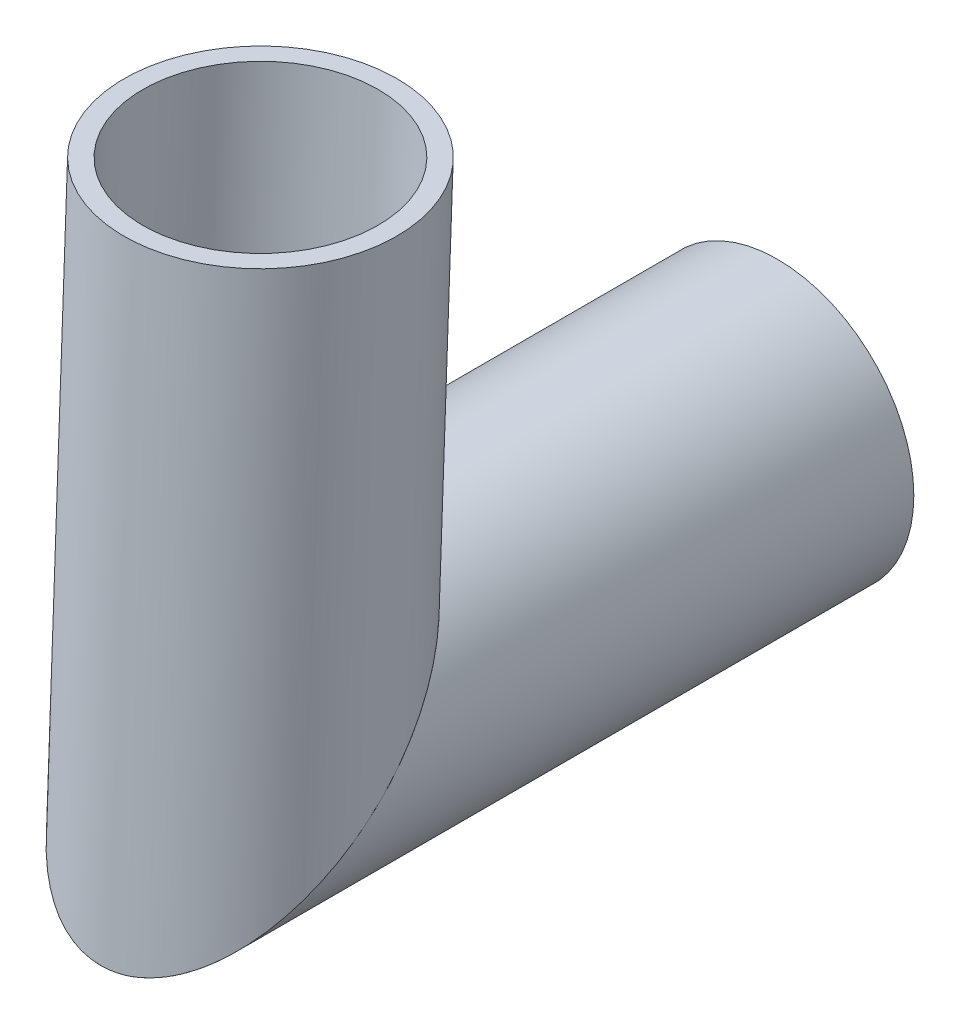
ISO-10303-21;
HEADER;
FILE_DESCRIPTION(('STEP AP214'),'2;1');
FILE_NAME('part.step','',(''),(''),'','','');
FILE_SCHEMA(('AUTOMOTIVE_DESIGN { 1 0 10303 214 1 1 1 1 }'));
ENDSEC;
DATA;
#1=APPLICATION_CONTEXT('core data for automotive mechanical design processes');
#2=APPLICATION_PROTOCOL_DEFINITION('international standard','automotive_design',2000,#1);
#3=PRODUCT_CONTEXT('',#1,'mechanical');
#4=PRODUCT('Part','Part','',(#3));
#5=PRODUCT_RELATED_PRODUCT_CATEGORY('part','',(#4));
#6=PRODUCT_DEFINITION_FORMATION('','',#4);
#7=PRODUCT_DEFINITION_CONTEXT('part definition',#1,'design');
#8=PRODUCT_DEFINITION('design','',#6,#7);
#9=PRODUCT_DEFINITION_SHAPE('','',#8);
#10=(LENGTH_UNIT() NAMED_UNIT(*) SI_UNIT(.MILLI.,.METRE.));
#11=(NAMED_UNIT(*) PLANE_ANGLE_UNIT() SI_UNIT($,.RADIAN.));
#12=(NAMED_UNIT(*) SI_UNIT($,.STERADIAN.) SOLID_ANGLE_UNIT());
#13=UNCERTAINTY_MEASURE_WITH_UNIT(LENGTH_MEASURE(1.E-05),#10,'distance_accuracy_value','');
#14=(GEOMETRIC_REPRESENTATION_CONTEXT(3) GLOBAL_UNCERTAINTY_ASSIGNED_CONTEXT((#13)) GLOBAL_UNIT_ASSIGNED_CONTEXT((#10,
#11,#12)) REPRESENTATION_CONTEXT('',''));
#15=CARTESIAN_POINT('',(0.,0.,0.));
#16=DIRECTION('',(0.,0.,1.));
#17=DIRECTION('',(1.,0.,0.));
#18=AXIS2_PLACEMENT_3D('',#15,#16,#17);
#19=CARTESIAN_POINT('',(25.4037084153649,1393.5417766657,2990.));
#20=DIRECTION('',(0.,0.,-1.));
#21=DIRECTION('',(-1.,0.,0.));
#22=AXIS2_PLACEMENT_3D('',#19,#20,#21);
#23=CYLINDRICAL_SURFACE('',#22,22.);
#24=CARTESIAN_POINT('',(25.4037084153649,1393.5417766657,2890.));
#25=DIRECTION('',(0.,0.,1.));
#26=DIRECTION('',(1.,0.,0.));
#27=AXIS2_PLACEMENT_3D('',#24,#25,#26);
#28=CIRCLE('',#27,22.);
#29=CARTESIAN_POINT('',(47.4037084153649,1393.5417766657,2890.));
#30=VERTEX_POINT('',#29);
#31=EDGE_CURVE('E62',#30,#30,#28,.T.);
#32=ORIENTED_EDGE('',*,*,#31,.F.);
#33=EDGE_LOOP('',(#32));
#34=FACE_BOUND('',#33,.T.);
#35=CARTESIAN_POINT('',(25.4037084153649,1393.5417766657,2990.));
#36=DIRECTION('',(-0.0052075345297579,0.722570262479926,0.691277872757267));
#37=DIRECTION('',(-0.00498188216971623,0.691259920879157,-0.722589027481174));
#38=AXIS2_PLACEMENT_3D('',#35,#36,#37);
#39=ELLIPSE('',#38,31.8251181861929,22.);
#40=CARTESIAN_POINT('',(25.245159426524,1415.54120534506,2967.00351880037));
#41=VERTEX_POINT('',#40);
#42=EDGE_CURVE('E58',#41,#41,#39,.T.);
#43=ORIENTED_EDGE('',*,*,#42,.T.);
#44=EDGE_LOOP('',(#43));
#45=FACE_BOUND('',#44,.T.);
#46=ADVANCED_FACE('F54',(#34,#45),#23,.F.);
#47=CARTESIAN_POINT('',(25.4037084153649,1393.5417766657,2990.));
#48=DIRECTION('',(0.,0.,-1.));
#49=DIRECTION('',(-1.,0.,0.));
#50=AXIS2_PLACEMENT_3D('',#47,#48,#49);
#51=CYLINDRICAL_SURFACE('',#50,25.5);
#52=CARTESIAN_POINT('',(25.4037084153649,1393.5417766657,2890.));
#53=DIRECTION('',(0.,0.,1.));
#54=DIRECTION('',(1.,0.,0.));
#55=AXIS2_PLACEMENT_3D('',#52,#53,#54);
#56=CIRCLE('',#55,25.5);
#57=CARTESIAN_POINT('',(50.9037084153649,1393.5417766657,2890.));
#58=VERTEX_POINT('',#57);
#59=EDGE_CURVE('E66',#58,#58,#56,.T.);
#60=ORIENTED_EDGE('',*,*,#59,.T.);
#61=EDGE_LOOP('',(#60));
#62=FACE_BOUND('',#61,.T.);
#63=CARTESIAN_POINT('',(25.4037084153649,1393.5417766657,2990.));
#64=DIRECTION('',(-0.0052075345297579,0.722570262479926,0.691277872757267));
#65=DIRECTION('',(-0.00498188216971623,0.691259920879157,-0.722589027481174));
#66=AXIS2_PLACEMENT_3D('',#63,#64,#65);
#67=ELLIPSE('',#66,36.8882051703599,25.5);
#68=CARTESIAN_POINT('',(25.2199357237539,1419.04111445314,2963.34498770042));
#69=VERTEX_POINT('',#68);
#70=EDGE_CURVE('E12',#69,#69,#67,.T.);
#71=ORIENTED_EDGE('',*,*,#70,.F.);
#72=EDGE_LOOP('',(#71));
#73=FACE_BOUND('',#72,.T.);
#74=ADVANCED_FACE('F81',(#62,#73),#51,.T.);
#75=CARTESIAN_POINT('',(25.4037084153649,1393.5417766657,2890.));
#76=DIRECTION('',(0.,0.,1.));
#77=DIRECTION('',(1.,0.,0.));
#78=AXIS2_PLACEMENT_3D('',#75,#76,#77);
#79=PLANE('',#78);
#80=ORIENTED_EDGE('',*,*,#31,.T.);
#81=EDGE_LOOP('',(#80));
#82=FACE_BOUND('',#81,.T.);
#83=ORIENTED_EDGE('',*,*,#59,.F.);
#84=EDGE_LOOP('',(#83));
#85=FACE_BOUND('',#84,.T.);
#86=ADVANCED_FACE('F77',(#82,#85),#79,.F.);
#87=CARTESIAN_POINT('',(25.4037084153649,1393.5417766657,2990.));
#88=DIRECTION('',(-0.0052075345297579,0.722570262479926,0.691277872757267));
#89=DIRECTION('',(0.,-0.691287246128331,0.72258006015964));
#90=AXIS2_PLACEMENT_3D('',#87,#88,#89);
#91=PLANE('',#90);
#92=ORIENTED_EDGE('',*,*,#42,.F.);
#93=EDGE_LOOP('',(#92));
#94=FACE_BOUND('',#93,.T.);
#95=ORIENTED_EDGE('',*,*,#70,.T.);
#96=EDGE_LOOP('',(#95));
#97=FACE_BOUND('',#96,.T.);
#98=ADVANCED_FACE('F56',(#94,#97),#91,.T.);
#99=CLOSED_SHELL('',(#46,#74,#86,#98));
#100=MANIFOLD_SOLID_BREP('B2',#99);
#101=CARTESIAN_POINT('',(23.6366012416464,1638.73632833836,2979.13435049204));
#102=DIRECTION('',(0.00719970678408211,-0.998993667929567,0.0442698052723766));
#103=DIRECTION('',(0.,-0.0442709526968791,-0.999019560743087));
#104=AXIS2_PLACEMENT_3D('',#101,#102,#103);
#105=CYLINDRICAL_SURFACE('',#104,22.);
#106=CARTESIAN_POINT('',(25.4037084153649,1393.5417766657,2990.));
#107=DIRECTION('',(0.0052075345297579,-0.722570262479926,-0.691277872757267));
#108=DIRECTION('',(0.00498188216971623,-0.691259920879157,0.722589027481174));
#109=AXIS2_PLACEMENT_3D('',#106,#107,#108);
#110=ELLIPSE('',#109,31.8251181861929,22.);
#111=CARTESIAN_POINT('',(25.5622574042058,1371.54234798634,3012.99648119964));
#112=VERTEX_POINT('',#111);
#113=EDGE_CURVE('E147',#112,#112,#110,.T.);
#114=ORIENTED_EDGE('',*,*,#113,.T.);
#115=EDGE_LOOP('',(#114));
#116=FACE_BOUND('',#115,.T.);
#117=CARTESIAN_POINT('',(24.7574093581775,1483.21885450817,2986.02601407704));
#118=DIRECTION('',(0.,1.,0.));
#119=DIRECTION('',(0.160523434739847,0.,0.987032029317855));
#120=AXIS2_PLACEMENT_3D('',#117,#118,#119);
#121=ELLIPSE('',#120,22.0221616074859,22.);
#122=CARTESIAN_POINT('',(28.2924823798071,1483.21885450817,3007.76259293844));
#123=VERTEX_POINT('',#122);
#124=EDGE_CURVE('E152',#123,#123,#121,.T.);
#125=ORIENTED_EDGE('',*,*,#124,.T.);
#126=EDGE_LOOP('',(#125));
#127=FACE_BOUND('',#126,.T.);
#128=ADVANCED_FACE('F139',(#116,#127),#105,.F.);
#129=CARTESIAN_POINT('',(23.6366012416464,1638.73632833836,2979.13435049204));
#130=DIRECTION('',(0.00719970678408211,-0.998993667929567,0.0442698052723766));
#131=DIRECTION('',(0.,-0.0442709526968791,-0.999019560743087));
#132=AXIS2_PLACEMENT_3D('',#129,#130,#131);
#133=CYLINDRICAL_SURFACE('',#132,25.5);
#134=CARTESIAN_POINT('',(25.4037084153649,1393.5417766657,2990.));
#135=DIRECTION('',(0.0052075345297579,-0.722570262479926,-0.691277872757267));
#136=DIRECTION('',(0.00498188216971623,-0.691259920879157,0.722589027481174));
#137=AXIS2_PLACEMENT_3D('',#134,#135,#136);
#138=ELLIPSE('',#137,36.8882051703599,25.5);
#139=CARTESIAN_POINT('',(25.5874811069759,1368.04243887826,3016.65501229958));
#140=VERTEX_POINT('',#139);
#141=EDGE_CURVE('E53',#140,#140,#138,.T.);
#142=ORIENTED_EDGE('',*,*,#141,.F.);
#143=EDGE_LOOP('',(#142));
#144=FACE_BOUND('',#143,.T.);
#145=CARTESIAN_POINT('',(24.7574093581775,1483.21885450817,2986.02601407704));
#146=DIRECTION('',(0.,1.,0.));
#147=DIRECTION('',(0.160523434739847,0.,0.987032029317855));
#148=AXIS2_PLACEMENT_3D('',#145,#146,#147);
#149=ELLIPSE('',#148,25.5256873177677,25.5);
#150=CARTESIAN_POINT('',(28.8548803605209,1483.21885450817,3011.22068503003));
#151=VERTEX_POINT('',#150);
#152=EDGE_CURVE('E143',#151,#151,#149,.T.);
#153=ORIENTED_EDGE('',*,*,#152,.F.);
#154=EDGE_LOOP('',(#153));
#155=FACE_BOUND('',#154,.T.);
#156=ADVANCED_FACE('F162',(#144,#155),#133,.T.);
#157=CARTESIAN_POINT('',(25.4037084153649,1393.5417766657,2990.));
#158=DIRECTION('',(0.0052075345297579,-0.722570262479926,-0.691277872757267));
#159=DIRECTION('',(0.,0.691287246128331,-0.72258006015964));
#160=AXIS2_PLACEMENT_3D('',#157,#158,#159);
#161=PLANE('',#160);
#162=ORIENTED_EDGE('',*,*,#113,.F.);
#163=EDGE_LOOP('',(#162));
#164=FACE_BOUND('',#163,.T.);
#165=ORIENTED_EDGE('',*,*,#141,.T.);
#166=EDGE_LOOP('',(#165));
#167=FACE_BOUND('',#166,.T.);
#168=ADVANCED_FACE('F141',(#164,#167),#161,.T.);
#169=CARTESIAN_POINT('',(1779.3171493029,1483.21885450817,4887.));
#170=DIRECTION('',(0.,1.,0.));
#171=DIRECTION('',(0.,0.,1.));
#172=AXIS2_PLACEMENT_3D('',#169,#170,#171);
#173=PLANE('',#172);
#174=ORIENTED_EDGE('',*,*,#124,.F.);
#175=EDGE_LOOP('',(#174));
#176=FACE_BOUND('',#175,.T.);
#177=ORIENTED_EDGE('',*,*,#152,.T.);
#178=EDGE_LOOP('',(#177));
#179=FACE_BOUND('',#178,.T.);
#180=ADVANCED_FACE('F160',(#176,#179),#173,.T.);
#181=CLOSED_SHELL('',(#128,#156,#168,#180));
#182=MANIFOLD_SOLID_BREP('B7',#181);
#183=ADVANCED_BREP_SHAPE_REPRESENTATION('',(#18,#100,#182),#14);
#184=SHAPE_DEFINITION_REPRESENTATION(#9,#183);
ENDSEC;
END-ISO-10303-21;
